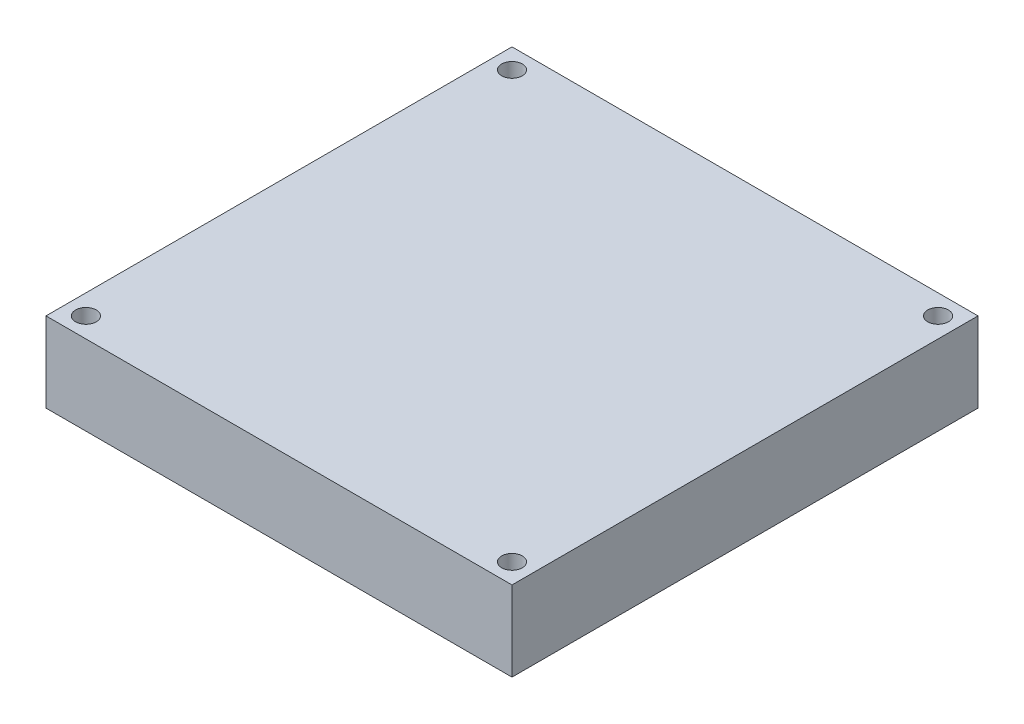
ISO-10303-21;
HEADER;
FILE_DESCRIPTION(('STEP AP214'),'2;1');
FILE_NAME('part.step','',(''),(''),'','','');
FILE_SCHEMA(('AUTOMOTIVE_DESIGN { 1 0 10303 214 1 1 1 1 }'));
ENDSEC;
DATA;
#1=APPLICATION_CONTEXT('core data for automotive mechanical design processes');
#2=APPLICATION_PROTOCOL_DEFINITION('international standard','automotive_design',2000,#1);
#3=PRODUCT_CONTEXT('',#1,'mechanical');
#4=PRODUCT('Part','Part','',(#3));
#5=PRODUCT_RELATED_PRODUCT_CATEGORY('part','',(#4));
#6=PRODUCT_DEFINITION_FORMATION('','',#4);
#7=PRODUCT_DEFINITION_CONTEXT('part definition',#1,'design');
#8=PRODUCT_DEFINITION('design','',#6,#7);
#9=PRODUCT_DEFINITION_SHAPE('','',#8);
#10=(LENGTH_UNIT() NAMED_UNIT(*) SI_UNIT(.MILLI.,.METRE.));
#11=(NAMED_UNIT(*) PLANE_ANGLE_UNIT() SI_UNIT($,.RADIAN.));
#12=(NAMED_UNIT(*) SI_UNIT($,.STERADIAN.) SOLID_ANGLE_UNIT());
#13=UNCERTAINTY_MEASURE_WITH_UNIT(LENGTH_MEASURE(1.E-05),#10,'distance_accuracy_value','');
#14=(GEOMETRIC_REPRESENTATION_CONTEXT(3) GLOBAL_UNCERTAINTY_ASSIGNED_CONTEXT((#13)) GLOBAL_UNIT_ASSIGNED_CONTEXT((#10,
#11,#12)) REPRESENTATION_CONTEXT('',''));
#15=CARTESIAN_POINT('',(0.,0.,0.));
#16=DIRECTION('',(0.,0.,1.));
#17=DIRECTION('',(1.,0.,0.));
#18=AXIS2_PLACEMENT_3D('',#15,#16,#17);
#19=CARTESIAN_POINT('',(35.,12.,35.));
#20=DIRECTION('',(-1.,0.,0.));
#21=DIRECTION('',(0.,0.,1.));
#22=AXIS2_PLACEMENT_3D('',#19,#20,#21);
#23=PLANE('',#22);
#24=DIRECTION('',(0.,0.,-1.));
#25=VECTOR('',#24,1.);
#26=CARTESIAN_POINT('',(35.,0.,35.));
#27=LINE('',#26,#25);
#28=CARTESIAN_POINT('',(35.,0.,35.));
#29=VERTEX_POINT('',#28);
#30=CARTESIAN_POINT('',(35.,0.,-35.));
#31=VERTEX_POINT('',#30);
#32=EDGE_CURVE('E102',#29,#31,#27,.T.);
#33=ORIENTED_EDGE('',*,*,#32,.T.);
#34=DIRECTION('',(0.,-1.,0.));
#35=VECTOR('',#34,1.);
#36=CARTESIAN_POINT('',(35.,12.,-35.));
#37=LINE('',#36,#35);
#38=CARTESIAN_POINT('',(35.,12.,-35.));
#39=VERTEX_POINT('',#38);
#40=EDGE_CURVE('E11',#39,#31,#37,.T.);
#41=ORIENTED_EDGE('',*,*,#40,.F.);
#42=DIRECTION('',(0.,0.,-1.));
#43=VECTOR('',#42,1.);
#44=CARTESIAN_POINT('',(35.,12.,35.));
#45=LINE('',#44,#43);
#46=CARTESIAN_POINT('',(35.,12.,35.));
#47=VERTEX_POINT('',#46);
#48=EDGE_CURVE('E90',#47,#39,#45,.T.);
#49=ORIENTED_EDGE('',*,*,#48,.F.);
#50=DIRECTION('',(0.,-1.,0.));
#51=VECTOR('',#50,1.);
#52=CARTESIAN_POINT('',(35.,12.,35.));
#53=LINE('',#52,#51);
#54=EDGE_CURVE('E98',#47,#29,#53,.T.);
#55=ORIENTED_EDGE('',*,*,#54,.T.);
#56=EDGE_LOOP('',(#33,#41,#49,#55));
#57=FACE_BOUND('',#56,.T.);
#58=ADVANCED_FACE('F39',(#57),#23,.F.);
#59=CARTESIAN_POINT('',(-35.,12.,-35.));
#60=DIRECTION('',(0.,0.,1.));
#61=DIRECTION('',(1.,0.,0.));
#62=AXIS2_PLACEMENT_3D('',#59,#60,#61);
#63=PLANE('',#62);
#64=DIRECTION('',(-1.,0.,0.));
#65=VECTOR('',#64,1.);
#66=CARTESIAN_POINT('',(-35.,0.,-35.));
#67=LINE('',#66,#65);
#68=CARTESIAN_POINT('',(-35.,0.,-35.));
#69=VERTEX_POINT('',#68);
#70=EDGE_CURVE('E94',#31,#69,#67,.T.);
#71=ORIENTED_EDGE('',*,*,#70,.T.);
#72=DIRECTION('',(0.,-1.,0.));
#73=VECTOR('',#72,1.);
#74=CARTESIAN_POINT('',(-35.,12.,-35.));
#75=LINE('',#74,#73);
#76=CARTESIAN_POINT('',(-35.,12.,-35.));
#77=VERTEX_POINT('',#76);
#78=EDGE_CURVE('E47',#77,#69,#75,.T.);
#79=ORIENTED_EDGE('',*,*,#78,.F.);
#80=DIRECTION('',(-1.,0.,0.));
#81=VECTOR('',#80,1.);
#82=CARTESIAN_POINT('',(-35.,12.,-35.));
#83=LINE('',#82,#81);
#84=EDGE_CURVE('E85',#39,#77,#83,.T.);
#85=ORIENTED_EDGE('',*,*,#84,.F.);
#86=ORIENTED_EDGE('',*,*,#40,.T.);
#87=EDGE_LOOP('',(#71,#79,#85,#86));
#88=FACE_BOUND('',#87,.T.);
#89=ADVANCED_FACE('F93',(#88),#63,.F.);
#90=CARTESIAN_POINT('',(-35.,12.,35.));
#91=DIRECTION('',(1.,0.,0.));
#92=DIRECTION('',(0.,0.,-1.));
#93=AXIS2_PLACEMENT_3D('',#90,#91,#92);
#94=PLANE('',#93);
#95=DIRECTION('',(0.,0.,1.));
#96=VECTOR('',#95,1.);
#97=CARTESIAN_POINT('',(-35.,0.,35.));
#98=LINE('',#97,#96);
#99=CARTESIAN_POINT('',(-35.,0.,35.));
#100=VERTEX_POINT('',#99);
#101=EDGE_CURVE('E72',#69,#100,#98,.T.);
#102=ORIENTED_EDGE('',*,*,#101,.T.);
#103=DIRECTION('',(0.,-1.,0.));
#104=VECTOR('',#103,1.);
#105=CARTESIAN_POINT('',(-35.,12.,35.));
#106=LINE('',#105,#104);
#107=CARTESIAN_POINT('',(-35.,12.,35.));
#108=VERTEX_POINT('',#107);
#109=EDGE_CURVE('E95',#108,#100,#106,.T.);
#110=ORIENTED_EDGE('',*,*,#109,.F.);
#111=DIRECTION('',(0.,0.,1.));
#112=VECTOR('',#111,1.);
#113=CARTESIAN_POINT('',(-35.,12.,35.));
#114=LINE('',#113,#112);
#115=EDGE_CURVE('E88',#77,#108,#114,.T.);
#116=ORIENTED_EDGE('',*,*,#115,.F.);
#117=ORIENTED_EDGE('',*,*,#78,.T.);
#118=EDGE_LOOP('',(#102,#110,#116,#117));
#119=FACE_BOUND('',#118,.T.);
#120=ADVANCED_FACE('F96',(#119),#94,.F.);
#121=CARTESIAN_POINT('',(-35.,12.,35.));
#122=DIRECTION('',(0.,0.,-1.));
#123=DIRECTION('',(-1.,0.,0.));
#124=AXIS2_PLACEMENT_3D('',#121,#122,#123);
#125=PLANE('',#124);
#126=DIRECTION('',(1.,0.,0.));
#127=VECTOR('',#126,1.);
#128=CARTESIAN_POINT('',(-35.,0.,35.));
#129=LINE('',#128,#127);
#130=EDGE_CURVE('E78',#100,#29,#129,.T.);
#131=ORIENTED_EDGE('',*,*,#130,.T.);
#132=ORIENTED_EDGE('',*,*,#54,.F.);
#133=DIRECTION('',(1.,0.,0.));
#134=VECTOR('',#133,1.);
#135=CARTESIAN_POINT('',(-35.,12.,35.));
#136=LINE('',#135,#134);
#137=EDGE_CURVE('E55',#108,#47,#136,.T.);
#138=ORIENTED_EDGE('',*,*,#137,.F.);
#139=ORIENTED_EDGE('',*,*,#109,.T.);
#140=EDGE_LOOP('',(#131,#132,#138,#139));
#141=FACE_BOUND('',#140,.T.);
#142=ADVANCED_FACE('F110',(#141),#125,.F.);
#143=CARTESIAN_POINT('',(0.,12.,0.));
#144=DIRECTION('',(0.,-1.,0.));
#145=DIRECTION('',(0.,0.,-1.));
#146=AXIS2_PLACEMENT_3D('',#143,#144,#145);
#147=PLANE('',#146);
#148=CARTESIAN_POINT('',(-32.,12.,32.));
#149=DIRECTION('',(0.,1.,0.));
#150=DIRECTION('',(0.,0.,-1.));
#151=AXIS2_PLACEMENT_3D('',#148,#149,#150);
#152=CIRCLE('',#151,1.55);
#153=CARTESIAN_POINT('',(-32.,12.,30.45));
#154=VERTEX_POINT('',#153);
#155=EDGE_CURVE('E122',#154,#154,#152,.T.);
#156=ORIENTED_EDGE('',*,*,#155,.F.);
#157=EDGE_LOOP('',(#156));
#158=FACE_BOUND('',#157,.T.);
#159=CARTESIAN_POINT('',(32.,12.,32.));
#160=DIRECTION('',(0.,1.,0.));
#161=DIRECTION('',(0.,0.,1.));
#162=AXIS2_PLACEMENT_3D('',#159,#160,#161);
#163=CIRCLE('',#162,1.55);
#164=CARTESIAN_POINT('',(32.,12.,33.55));
#165=VERTEX_POINT('',#164);
#166=EDGE_CURVE('E129',#165,#165,#163,.T.);
#167=ORIENTED_EDGE('',*,*,#166,.F.);
#168=EDGE_LOOP('',(#167));
#169=FACE_BOUND('',#168,.T.);
#170=CARTESIAN_POINT('',(32.,12.,-32.));
#171=DIRECTION('',(0.,1.,0.));
#172=DIRECTION('',(0.,0.,-1.));
#173=AXIS2_PLACEMENT_3D('',#170,#171,#172);
#174=CIRCLE('',#173,1.55);
#175=CARTESIAN_POINT('',(32.,12.,-33.55));
#176=VERTEX_POINT('',#175);
#177=EDGE_CURVE('E121',#176,#176,#174,.T.);
#178=ORIENTED_EDGE('',*,*,#177,.F.);
#179=EDGE_LOOP('',(#178));
#180=FACE_BOUND('',#179,.T.);
#181=CARTESIAN_POINT('',(-32.,12.,-32.));
#182=DIRECTION('',(0.,1.,0.));
#183=DIRECTION('',(0.,0.,1.));
#184=AXIS2_PLACEMENT_3D('',#181,#182,#183);
#185=CIRCLE('',#184,1.55);
#186=CARTESIAN_POINT('',(-32.,12.,-30.45));
#187=VERTEX_POINT('',#186);
#188=EDGE_CURVE('E118',#187,#187,#185,.T.);
#189=ORIENTED_EDGE('',*,*,#188,.F.);
#190=EDGE_LOOP('',(#189));
#191=FACE_BOUND('',#190,.T.);
#192=ORIENTED_EDGE('',*,*,#48,.T.);
#193=ORIENTED_EDGE('',*,*,#84,.T.);
#194=ORIENTED_EDGE('',*,*,#115,.T.);
#195=ORIENTED_EDGE('',*,*,#137,.T.);
#196=EDGE_LOOP('',(#192,#193,#194,#195));
#197=FACE_BOUND('',#196,.T.);
#198=ADVANCED_FACE('F86',(#158,#169,#180,#191,#197),#147,.F.);
#199=CARTESIAN_POINT('',(0.,0.,0.));
#200=DIRECTION('',(0.,-1.,0.));
#201=DIRECTION('',(0.,0.,-1.));
#202=AXIS2_PLACEMENT_3D('',#199,#200,#201);
#203=PLANE('',#202);
#204=CARTESIAN_POINT('',(-32.,0.,32.));
#205=DIRECTION('',(0.,-1.,0.));
#206=DIRECTION('',(0.,0.,-1.));
#207=AXIS2_PLACEMENT_3D('',#204,#205,#206);
#208=CIRCLE('',#207,1.55);
#209=CARTESIAN_POINT('',(-32.,0.,30.45));
#210=VERTEX_POINT('',#209);
#211=EDGE_CURVE('E126',#210,#210,#208,.F.);
#212=ORIENTED_EDGE('',*,*,#211,.T.);
#213=EDGE_LOOP('',(#212));
#214=FACE_BOUND('',#213,.T.);
#215=CARTESIAN_POINT('',(32.,0.,32.));
#216=DIRECTION('',(0.,-1.,0.));
#217=DIRECTION('',(0.,0.,-1.));
#218=AXIS2_PLACEMENT_3D('',#215,#216,#217);
#219=CIRCLE('',#218,1.55);
#220=CARTESIAN_POINT('',(32.,0.,30.45));
#221=VERTEX_POINT('',#220);
#222=EDGE_CURVE('E125',#221,#221,#219,.F.);
#223=ORIENTED_EDGE('',*,*,#222,.T.);
#224=EDGE_LOOP('',(#223));
#225=FACE_BOUND('',#224,.T.);
#226=CARTESIAN_POINT('',(32.,0.,-32.));
#227=DIRECTION('',(0.,-1.,0.));
#228=DIRECTION('',(0.,0.,-1.));
#229=AXIS2_PLACEMENT_3D('',#226,#227,#228);
#230=CIRCLE('',#229,1.55);
#231=CARTESIAN_POINT('',(32.,0.,-33.55));
#232=VERTEX_POINT('',#231);
#233=EDGE_CURVE('E132',#232,#232,#230,.F.);
#234=ORIENTED_EDGE('',*,*,#233,.T.);
#235=EDGE_LOOP('',(#234));
#236=FACE_BOUND('',#235,.T.);
#237=CARTESIAN_POINT('',(-32.,0.,-32.));
#238=DIRECTION('',(0.,-1.,0.));
#239=DIRECTION('',(0.,0.,-1.));
#240=AXIS2_PLACEMENT_3D('',#237,#238,#239);
#241=CIRCLE('',#240,1.55);
#242=CARTESIAN_POINT('',(-32.,0.,-33.55));
#243=VERTEX_POINT('',#242);
#244=EDGE_CURVE('E105',#243,#243,#241,.F.);
#245=ORIENTED_EDGE('',*,*,#244,.T.);
#246=EDGE_LOOP('',(#245));
#247=FACE_BOUND('',#246,.T.);
#248=ORIENTED_EDGE('',*,*,#32,.F.);
#249=ORIENTED_EDGE('',*,*,#130,.F.);
#250=ORIENTED_EDGE('',*,*,#101,.F.);
#251=ORIENTED_EDGE('',*,*,#70,.F.);
#252=EDGE_LOOP('',(#248,#249,#250,#251));
#253=FACE_BOUND('',#252,.T.);
#254=ADVANCED_FACE('F113',(#214,#225,#236,#247,#253),#203,.T.);
#255=CARTESIAN_POINT('',(-32.,-4.3840620433566,-32.));
#256=DIRECTION('',(0.,1.,0.));
#257=DIRECTION('',(0.,0.,1.));
#258=AXIS2_PLACEMENT_3D('',#255,#256,#257);
#259=CYLINDRICAL_SURFACE('',#258,1.55);
#260=ORIENTED_EDGE('',*,*,#188,.T.);
#261=EDGE_LOOP('',(#260));
#262=FACE_BOUND('',#261,.T.);
#263=ORIENTED_EDGE('',*,*,#244,.F.);
#264=EDGE_LOOP('',(#263));
#265=FACE_BOUND('',#264,.T.);
#266=ADVANCED_FACE('F145',(#262,#265),#259,.F.);
#267=CARTESIAN_POINT('',(32.,-4.3840620433566,-32.));
#268=DIRECTION('',(0.,1.,0.));
#269=DIRECTION('',(0.,0.,1.));
#270=AXIS2_PLACEMENT_3D('',#267,#268,#269);
#271=CYLINDRICAL_SURFACE('',#270,1.55);
#272=ORIENTED_EDGE('',*,*,#177,.T.);
#273=EDGE_LOOP('',(#272));
#274=FACE_BOUND('',#273,.T.);
#275=ORIENTED_EDGE('',*,*,#233,.F.);
#276=EDGE_LOOP('',(#275));
#277=FACE_BOUND('',#276,.T.);
#278=ADVANCED_FACE('F142',(#274,#277),#271,.F.);
#279=CARTESIAN_POINT('',(32.,-4.3840620433566,32.));
#280=DIRECTION('',(0.,1.,0.));
#281=DIRECTION('',(0.,0.,1.));
#282=AXIS2_PLACEMENT_3D('',#279,#280,#281);
#283=CYLINDRICAL_SURFACE('',#282,1.55);
#284=ORIENTED_EDGE('',*,*,#166,.T.);
#285=EDGE_LOOP('',(#284));
#286=FACE_BOUND('',#285,.T.);
#287=ORIENTED_EDGE('',*,*,#222,.F.);
#288=EDGE_LOOP('',(#287));
#289=FACE_BOUND('',#288,.T.);
#290=ADVANCED_FACE('F144',(#286,#289),#283,.F.);
#291=CARTESIAN_POINT('',(-32.,-4.3840620433566,32.));
#292=DIRECTION('',(0.,1.,0.));
#293=DIRECTION('',(0.,0.,1.));
#294=AXIS2_PLACEMENT_3D('',#291,#292,#293);
#295=CYLINDRICAL_SURFACE('',#294,1.55);
#296=ORIENTED_EDGE('',*,*,#155,.T.);
#297=EDGE_LOOP('',(#296));
#298=FACE_BOUND('',#297,.T.);
#299=ORIENTED_EDGE('',*,*,#211,.F.);
#300=EDGE_LOOP('',(#299));
#301=FACE_BOUND('',#300,.T.);
#302=ADVANCED_FACE('F152',(#298,#301),#295,.F.);
#303=CLOSED_SHELL('',(#58,#89,#120,#142,#198,#254,#266,#278,#290,#302));
#304=MANIFOLD_SOLID_BREP('B2',#303);
#305=ADVANCED_BREP_SHAPE_REPRESENTATION('',(#18,#304),#14);
#306=SHAPE_DEFINITION_REPRESENTATION(#9,#305);
ENDSEC;
END-ISO-10303-21;
